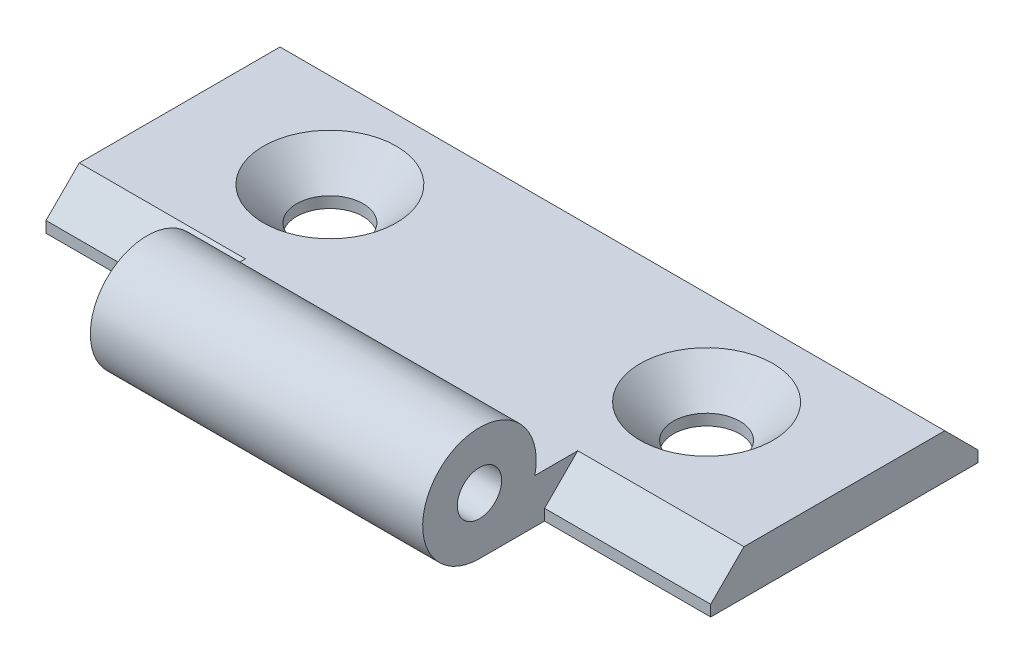
ISO-10303-21;
HEADER;
FILE_DESCRIPTION(('STEP AP214'),'2;1');
FILE_NAME('part.step','',(''),(''),'','','');
FILE_SCHEMA(('AUTOMOTIVE_DESIGN { 1 0 10303 214 1 1 1 1 }'));
ENDSEC;
DATA;
#1=APPLICATION_CONTEXT('core data for automotive mechanical design processes');
#2=APPLICATION_PROTOCOL_DEFINITION('international standard','automotive_design',2000,#1);
#3=PRODUCT_CONTEXT('',#1,'mechanical');
#4=PRODUCT('Part','Part','',(#3));
#5=PRODUCT_RELATED_PRODUCT_CATEGORY('part','',(#4));
#6=PRODUCT_DEFINITION_FORMATION('','',#4);
#7=PRODUCT_DEFINITION_CONTEXT('part definition',#1,'design');
#8=PRODUCT_DEFINITION('design','',#6,#7);
#9=PRODUCT_DEFINITION_SHAPE('','',#8);
#10=(LENGTH_UNIT() NAMED_UNIT(*) SI_UNIT(.MILLI.,.METRE.));
#11=(NAMED_UNIT(*) PLANE_ANGLE_UNIT() SI_UNIT($,.RADIAN.));
#12=(NAMED_UNIT(*) SI_UNIT($,.STERADIAN.) SOLID_ANGLE_UNIT());
#13=UNCERTAINTY_MEASURE_WITH_UNIT(LENGTH_MEASURE(1.E-05),#10,'distance_accuracy_value','');
#14=(GEOMETRIC_REPRESENTATION_CONTEXT(3) GLOBAL_UNCERTAINTY_ASSIGNED_CONTEXT((#13)) GLOBAL_UNIT_ASSIGNED_CONTEXT((#10,
#11,#12)) REPRESENTATION_CONTEXT('',''));
#15=CARTESIAN_POINT('',(0.,0.,0.));
#16=DIRECTION('',(0.,0.,1.));
#17=DIRECTION('',(1.,0.,0.));
#18=AXIS2_PLACEMENT_3D('',#15,#16,#17);
#19=CARTESIAN_POINT('',(30.,5.125,0.));
#20=DIRECTION('',(1.,0.,0.));
#21=DIRECTION('',(0.,0.,-1.));
#22=AXIS2_PLACEMENT_3D('',#19,#20,#21);
#23=PLANE('',#22);
#24=DIRECTION('',(0.,0.,1.));
#25=VECTOR('',#24,1.);
#26=CARTESIAN_POINT('',(30.,4.,-5.));
#27=LINE('',#26,#25);
#28=CARTESIAN_POINT('',(30.,4.,-27.));
#29=VERTEX_POINT('',#28);
#30=CARTESIAN_POINT('',(30.,4.,-8.87500000000002));
#31=VERTEX_POINT('',#30);
#32=EDGE_CURVE('E152',#29,#31,#27,.T.);
#33=ORIENTED_EDGE('',*,*,#32,.T.);
#34=DIRECTION('',(0.,-0.707106781186546,0.707106781186549));
#35=VECTOR('',#34,1.);
#36=CARTESIAN_POINT('',(30.,0.124999999999986,-4.99999999999999));
#37=LINE('',#36,#35);
#38=CARTESIAN_POINT('',(30.,0.999999999999997,-5.875));
#39=VERTEX_POINT('',#38);
#40=EDGE_CURVE('E127',#31,#39,#37,.T.);
#41=ORIENTED_EDGE('',*,*,#40,.T.);
#42=DIRECTION('',(0.,-1.,0.));
#43=VECTOR('',#42,1.);
#44=CARTESIAN_POINT('',(30.,10.25,-5.875));
#45=LINE('',#44,#43);
#46=CARTESIAN_POINT('',(30.,0.,-5.875));
#47=VERTEX_POINT('',#46);
#48=EDGE_CURVE('E119',#39,#47,#45,.T.);
#49=ORIENTED_EDGE('',*,*,#48,.T.);
#50=DIRECTION('',(0.,0.,-1.));
#51=VECTOR('',#50,1.);
#52=CARTESIAN_POINT('',(30.,0.,0.));
#53=LINE('',#52,#51);
#54=CARTESIAN_POINT('',(30.,0.,-30.));
#55=VERTEX_POINT('',#54);
#56=EDGE_CURVE('E124',#47,#55,#53,.T.);
#57=ORIENTED_EDGE('',*,*,#56,.T.);
#58=DIRECTION('',(0.,1.,0.));
#59=VECTOR('',#58,1.);
#60=CARTESIAN_POINT('',(30.,0.,-30.));
#61=LINE('',#60,#59);
#62=CARTESIAN_POINT('',(30.,0.999999999999984,-30.));
#63=VERTEX_POINT('',#62);
#64=EDGE_CURVE('E149',#55,#63,#61,.T.);
#65=ORIENTED_EDGE('',*,*,#64,.T.);
#66=DIRECTION('',(0.,-0.707106781186549,-0.707106781186546));
#67=VECTOR('',#66,1.);
#68=CARTESIAN_POINT('',(30.,18.0625,-12.9375000000001));
#69=LINE('',#68,#67);
#70=EDGE_CURVE('E198',#63,#29,#69,.F.);
#71=ORIENTED_EDGE('',*,*,#70,.T.);
#72=EDGE_LOOP('',(#33,#41,#49,#57,#65,#71));
#73=FACE_BOUND('',#72,.T.);
#74=ADVANCED_FACE('F37',(#73),#23,.T.);
#75=CARTESIAN_POINT('',(-30.,5.125,0.));
#76=DIRECTION('',(1.,0.,0.));
#77=DIRECTION('',(0.,0.,-1.));
#78=AXIS2_PLACEMENT_3D('',#75,#76,#77);
#79=PLANE('',#78);
#80=DIRECTION('',(0.,-1.,0.));
#81=VECTOR('',#80,1.);
#82=CARTESIAN_POINT('',(-30.,10.25,-5.875));
#83=LINE('',#82,#81);
#84=CARTESIAN_POINT('',(-30.,0.999999999999997,-5.875));
#85=VERTEX_POINT('',#84);
#86=CARTESIAN_POINT('',(-30.,0.,-5.875));
#87=VERTEX_POINT('',#86);
#88=EDGE_CURVE('E233',#85,#87,#83,.T.);
#89=ORIENTED_EDGE('',*,*,#88,.F.);
#90=DIRECTION('',(0.,0.707106781186546,-0.707106781186549));
#91=VECTOR('',#90,1.);
#92=CARTESIAN_POINT('',(-30.,0.999999999999997,-5.875));
#93=LINE('',#92,#91);
#94=CARTESIAN_POINT('',(-30.,4.,-8.87500000000002));
#95=VERTEX_POINT('',#94);
#96=EDGE_CURVE('E205',#85,#95,#93,.T.);
#97=ORIENTED_EDGE('',*,*,#96,.T.);
#98=DIRECTION('',(0.,0.,1.));
#99=VECTOR('',#98,1.);
#100=CARTESIAN_POINT('',(-30.,4.,-5.));
#101=LINE('',#100,#99);
#102=CARTESIAN_POINT('',(-30.,4.,-27.));
#103=VERTEX_POINT('',#102);
#104=EDGE_CURVE('E150',#103,#95,#101,.T.);
#105=ORIENTED_EDGE('',*,*,#104,.F.);
#106=DIRECTION('',(0.,0.707106781186549,0.707106781186546));
#107=VECTOR('',#106,1.);
#108=CARTESIAN_POINT('',(-30.,4.,-27.));
#109=LINE('',#108,#107);
#110=CARTESIAN_POINT('',(-30.,0.999999999999984,-30.));
#111=VERTEX_POINT('',#110);
#112=EDGE_CURVE('E53',#103,#111,#109,.F.);
#113=ORIENTED_EDGE('',*,*,#112,.T.);
#114=DIRECTION('',(0.,1.,0.));
#115=VECTOR('',#114,1.);
#116=CARTESIAN_POINT('',(-30.,0.,-30.));
#117=LINE('',#116,#115);
#118=CARTESIAN_POINT('',(-30.,0.,-30.));
#119=VERTEX_POINT('',#118);
#120=EDGE_CURVE('E155',#119,#111,#117,.T.);
#121=ORIENTED_EDGE('',*,*,#120,.F.);
#122=DIRECTION('',(0.,0.,-1.));
#123=VECTOR('',#122,1.);
#124=CARTESIAN_POINT('',(-30.,0.,0.));
#125=LINE('',#124,#123);
#126=EDGE_CURVE('E163',#87,#119,#125,.T.);
#127=ORIENTED_EDGE('',*,*,#126,.F.);
#128=EDGE_LOOP('',(#89,#97,#105,#113,#121,#127));
#129=FACE_BOUND('',#128,.T.);
#130=ADVANCED_FACE('F231',(#129),#79,.F.);
#131=CARTESIAN_POINT('',(30.,5.125,0.));
#132=DIRECTION('',(-1.,0.,0.));
#133=DIRECTION('',(0.,0.,1.));
#134=AXIS2_PLACEMENT_3D('',#131,#132,#133);
#135=CYLINDRICAL_SURFACE('',#134,5.125);
#136=DIRECTION('',(-1.,0.,0.));
#137=VECTOR('',#136,1.);
#138=CARTESIAN_POINT('',(30.,4.,-5.));
#139=LINE('',#138,#137);
#140=CARTESIAN_POINT('',(15.,4.,-5.));
#141=VERTEX_POINT('',#140);
#142=CARTESIAN_POINT('',(-15.,4.,-5.));
#143=VERTEX_POINT('',#142);
#144=EDGE_CURVE('E162',#141,#143,#139,.T.);
#145=ORIENTED_EDGE('',*,*,#144,.T.);
#146=CARTESIAN_POINT('',(-15.,5.125,0.));
#147=DIRECTION('',(-1.,0.,0.));
#148=DIRECTION('',(0.,0.,1.));
#149=AXIS2_PLACEMENT_3D('',#146,#147,#148);
#150=CIRCLE('',#149,5.125);
#151=CARTESIAN_POINT('',(-15.,0.,0.));
#152=VERTEX_POINT('',#151);
#153=EDGE_CURVE('E158',#152,#143,#150,.T.);
#154=ORIENTED_EDGE('',*,*,#153,.F.);
#155=DIRECTION('',(-1.,0.,0.));
#156=VECTOR('',#155,1.);
#157=CARTESIAN_POINT('',(30.,0.,0.));
#158=LINE('',#157,#156);
#159=CARTESIAN_POINT('',(15.,0.,0.));
#160=VERTEX_POINT('',#159);
#161=EDGE_CURVE('E169',#160,#152,#158,.T.);
#162=ORIENTED_EDGE('',*,*,#161,.F.);
#163=CARTESIAN_POINT('',(15.,5.125,0.));
#164=DIRECTION('',(1.,0.,0.));
#165=DIRECTION('',(0.,0.,-1.));
#166=AXIS2_PLACEMENT_3D('',#163,#164,#165);
#167=CIRCLE('',#166,5.125);
#168=EDGE_CURVE('E182',#141,#160,#167,.T.);
#169=ORIENTED_EDGE('',*,*,#168,.F.);
#170=EDGE_LOOP('',(#145,#154,#162,#169));
#171=FACE_BOUND('',#170,.T.);
#172=ADVANCED_FACE('F258',(#171),#135,.T.);
#173=CARTESIAN_POINT('',(30.,0.,0.));
#174=DIRECTION('',(0.,1.,0.));
#175=DIRECTION('',(0.,0.,1.));
#176=AXIS2_PLACEMENT_3D('',#173,#174,#175);
#177=PLANE('',#176);
#178=CARTESIAN_POINT('',(17.,0.,-18.5));
#179=DIRECTION('',(0.,1.,0.));
#180=DIRECTION('',(0.,0.,1.));
#181=AXIS2_PLACEMENT_3D('',#178,#179,#180);
#182=CIRCLE('',#181,3.);
#183=CARTESIAN_POINT('',(17.,0.,-15.5));
#184=VERTEX_POINT('',#183);
#185=EDGE_CURVE('E243',#184,#184,#182,.T.);
#186=ORIENTED_EDGE('',*,*,#185,.T.);
#187=EDGE_LOOP('',(#186));
#188=FACE_BOUND('',#187,.T.);
#189=DIRECTION('',(0.,0.,-1.));
#190=VECTOR('',#189,1.);
#191=CARTESIAN_POINT('',(-15.,0.,5.125));
#192=LINE('',#191,#190);
#193=CARTESIAN_POINT('',(-15.,0.,-5.875));
#194=VERTEX_POINT('',#193);
#195=EDGE_CURVE('E131',#152,#194,#192,.T.);
#196=ORIENTED_EDGE('',*,*,#195,.T.);
#197=DIRECTION('',(-1.,0.,0.));
#198=VECTOR('',#197,1.);
#199=CARTESIAN_POINT('',(-30.,0.,-5.875));
#200=LINE('',#199,#198);
#201=EDGE_CURVE('E242',#194,#87,#200,.T.);
#202=ORIENTED_EDGE('',*,*,#201,.T.);
#203=ORIENTED_EDGE('',*,*,#126,.T.);
#204=DIRECTION('',(-1.,0.,0.));
#205=VECTOR('',#204,1.);
#206=CARTESIAN_POINT('',(30.,0.,-30.));
#207=LINE('',#206,#205);
#208=EDGE_CURVE('E147',#55,#119,#207,.T.);
#209=ORIENTED_EDGE('',*,*,#208,.F.);
#210=ORIENTED_EDGE('',*,*,#56,.F.);
#211=DIRECTION('',(-1.,0.,0.));
#212=VECTOR('',#211,1.);
#213=CARTESIAN_POINT('',(30.,0.,-5.875));
#214=LINE('',#213,#212);
#215=CARTESIAN_POINT('',(15.,0.,-5.875));
#216=VERTEX_POINT('',#215);
#217=EDGE_CURVE('E135',#47,#216,#214,.T.);
#218=ORIENTED_EDGE('',*,*,#217,.T.);
#219=DIRECTION('',(0.,0.,1.));
#220=VECTOR('',#219,1.);
#221=CARTESIAN_POINT('',(15.,0.,5.125));
#222=LINE('',#221,#220);
#223=EDGE_CURVE('E141',#216,#160,#222,.T.);
#224=ORIENTED_EDGE('',*,*,#223,.T.);
#225=ORIENTED_EDGE('',*,*,#161,.T.);
#226=EDGE_LOOP('',(#196,#202,#203,#209,#210,#218,#224,#225));
#227=FACE_BOUND('',#226,.T.);
#228=CARTESIAN_POINT('',(-17.,0.,-18.5));
#229=DIRECTION('',(0.,1.,0.));
#230=DIRECTION('',(0.,0.,1.));
#231=AXIS2_PLACEMENT_3D('',#228,#229,#230);
#232=CIRCLE('',#231,3.);
#233=CARTESIAN_POINT('',(-17.,0.,-15.5));
#234=VERTEX_POINT('',#233);
#235=EDGE_CURVE('E177',#234,#234,#232,.T.);
#236=ORIENTED_EDGE('',*,*,#235,.T.);
#237=EDGE_LOOP('',(#236));
#238=FACE_BOUND('',#237,.T.);
#239=ADVANCED_FACE('F144',(#188,#227,#238),#177,.F.);
#240=CARTESIAN_POINT('',(30.,0.,-30.));
#241=DIRECTION('',(0.,0.,1.));
#242=DIRECTION('',(1.,0.,0.));
#243=AXIS2_PLACEMENT_3D('',#240,#241,#242);
#244=PLANE('',#243);
#245=ORIENTED_EDGE('',*,*,#120,.T.);
#246=DIRECTION('',(1.,0.,0.));
#247=VECTOR('',#246,1.);
#248=CARTESIAN_POINT('',(30.,0.999999999999984,-30.));
#249=LINE('',#248,#247);
#250=EDGE_CURVE('E213',#111,#63,#249,.T.);
#251=ORIENTED_EDGE('',*,*,#250,.T.);
#252=ORIENTED_EDGE('',*,*,#64,.F.);
#253=ORIENTED_EDGE('',*,*,#208,.T.);
#254=EDGE_LOOP('',(#245,#251,#252,#253));
#255=FACE_BOUND('',#254,.T.);
#256=ADVANCED_FACE('F263',(#255),#244,.F.);
#257=CARTESIAN_POINT('',(30.,4.,-5.));
#258=DIRECTION('',(0.,-1.,0.));
#259=DIRECTION('',(0.,0.,-1.));
#260=AXIS2_PLACEMENT_3D('',#257,#258,#259);
#261=PLANE('',#260);
#262=CARTESIAN_POINT('',(-17.,4.,-18.5));
#263=DIRECTION('',(0.,-1.,0.));
#264=DIRECTION('',(0.,0.,-1.));
#265=AXIS2_PLACEMENT_3D('',#262,#263,#264);
#266=CIRCLE('',#265,6.00000000000001);
#267=CARTESIAN_POINT('',(-17.,4.,-24.5));
#268=VERTEX_POINT('',#267);
#269=EDGE_CURVE('E190',#268,#268,#266,.T.);
#270=ORIENTED_EDGE('',*,*,#269,.T.);
#271=EDGE_LOOP('',(#270));
#272=FACE_BOUND('',#271,.T.);
#273=CARTESIAN_POINT('',(17.,4.,-18.5));
#274=DIRECTION('',(0.,-1.,0.));
#275=DIRECTION('',(0.,0.,-1.));
#276=AXIS2_PLACEMENT_3D('',#273,#274,#275);
#277=CIRCLE('',#276,6.00000000000001);
#278=CARTESIAN_POINT('',(17.,4.,-24.5));
#279=VERTEX_POINT('',#278);
#280=EDGE_CURVE('E187',#279,#279,#277,.T.);
#281=ORIENTED_EDGE('',*,*,#280,.T.);
#282=EDGE_LOOP('',(#281));
#283=FACE_BOUND('',#282,.T.);
#284=DIRECTION('',(0.,0.,1.));
#285=VECTOR('',#284,1.);
#286=CARTESIAN_POINT('',(15.,4.,-5.));
#287=LINE('',#286,#285);
#288=CARTESIAN_POINT('',(15.,4.,-8.87500000000002));
#289=VERTEX_POINT('',#288);
#290=EDGE_CURVE('E176',#289,#141,#287,.T.);
#291=ORIENTED_EDGE('',*,*,#290,.F.);
#292=DIRECTION('',(1.,0.,0.));
#293=VECTOR('',#292,1.);
#294=CARTESIAN_POINT('',(30.,4.,-8.87500000000002));
#295=LINE('',#294,#293);
#296=EDGE_CURVE('E196',#289,#31,#295,.T.);
#297=ORIENTED_EDGE('',*,*,#296,.T.);
#298=ORIENTED_EDGE('',*,*,#32,.F.);
#299=DIRECTION('',(-1.,0.,0.));
#300=VECTOR('',#299,1.);
#301=CARTESIAN_POINT('',(30.,4.,-27.));
#302=LINE('',#301,#300);
#303=EDGE_CURVE('E184',#29,#103,#302,.T.);
#304=ORIENTED_EDGE('',*,*,#303,.T.);
#305=ORIENTED_EDGE('',*,*,#104,.T.);
#306=DIRECTION('',(1.,0.,0.));
#307=VECTOR('',#306,1.);
#308=CARTESIAN_POINT('',(-15.,4.,-8.87500000000002));
#309=LINE('',#308,#307);
#310=CARTESIAN_POINT('',(-15.,4.,-8.87500000000002));
#311=VERTEX_POINT('',#310);
#312=EDGE_CURVE('E193',#95,#311,#309,.T.);
#313=ORIENTED_EDGE('',*,*,#312,.T.);
#314=DIRECTION('',(0.,0.,-1.));
#315=VECTOR('',#314,1.);
#316=CARTESIAN_POINT('',(-15.,4.,-5.));
#317=LINE('',#316,#315);
#318=EDGE_CURVE('E181',#143,#311,#317,.T.);
#319=ORIENTED_EDGE('',*,*,#318,.F.);
#320=ORIENTED_EDGE('',*,*,#144,.F.);
#321=EDGE_LOOP('',(#291,#297,#298,#304,#305,#313,#319,#320));
#322=FACE_BOUND('',#321,.T.);
#323=ADVANCED_FACE('F224',(#272,#283,#322),#261,.F.);
#324=CARTESIAN_POINT('',(30.,10.25,-5.875));
#325=DIRECTION('',(0.,0.,1.));
#326=DIRECTION('',(1.,0.,0.));
#327=AXIS2_PLACEMENT_3D('',#324,#325,#326);
#328=PLANE('',#327);
#329=ORIENTED_EDGE('',*,*,#48,.F.);
#330=DIRECTION('',(-1.,0.,0.));
#331=VECTOR('',#330,1.);
#332=CARTESIAN_POINT('',(15.,0.999999999999997,-5.875));
#333=LINE('',#332,#331);
#334=CARTESIAN_POINT('',(15.,0.999999999999997,-5.875));
#335=VERTEX_POINT('',#334);
#336=EDGE_CURVE('E172',#39,#335,#333,.T.);
#337=ORIENTED_EDGE('',*,*,#336,.T.);
#338=DIRECTION('',(0.,-1.,0.));
#339=VECTOR('',#338,1.);
#340=CARTESIAN_POINT('',(15.,10.25,-5.875));
#341=LINE('',#340,#339);
#342=EDGE_CURVE('E132',#335,#216,#341,.T.);
#343=ORIENTED_EDGE('',*,*,#342,.T.);
#344=ORIENTED_EDGE('',*,*,#217,.F.);
#345=EDGE_LOOP('',(#329,#337,#343,#344));
#346=FACE_BOUND('',#345,.T.);
#347=ADVANCED_FACE('F136',(#346),#328,.T.);
#348=CARTESIAN_POINT('',(15.,10.25,5.125));
#349=DIRECTION('',(1.,0.,0.));
#350=DIRECTION('',(0.,0.,-1.));
#351=AXIS2_PLACEMENT_3D('',#348,#349,#350);
#352=PLANE('',#351);
#353=CARTESIAN_POINT('',(15.,5.125,0.));
#354=DIRECTION('',(1.,0.,0.));
#355=DIRECTION('',(0.,0.,-1.));
#356=AXIS2_PLACEMENT_3D('',#353,#354,#355);
#357=CIRCLE('',#356,2.);
#358=CARTESIAN_POINT('',(15.,5.125,-2.));
#359=VERTEX_POINT('',#358);
#360=EDGE_CURVE('E173',#359,#359,#357,.T.);
#361=ORIENTED_EDGE('',*,*,#360,.F.);
#362=EDGE_LOOP('',(#361));
#363=FACE_BOUND('',#362,.T.);
#364=ORIENTED_EDGE('',*,*,#168,.T.);
#365=ORIENTED_EDGE('',*,*,#223,.F.);
#366=ORIENTED_EDGE('',*,*,#342,.F.);
#367=DIRECTION('',(0.,0.707106781186546,-0.707106781186549));
#368=VECTOR('',#367,1.);
#369=CARTESIAN_POINT('',(15.,0.999999999999997,-5.875));
#370=LINE('',#369,#368);
#371=EDGE_CURVE('E46',#335,#289,#370,.T.);
#372=ORIENTED_EDGE('',*,*,#371,.T.);
#373=ORIENTED_EDGE('',*,*,#290,.T.);
#374=EDGE_LOOP('',(#364,#365,#366,#372,#373));
#375=FACE_BOUND('',#374,.T.);
#376=ADVANCED_FACE('F218',(#363,#375),#352,.T.);
#377=CARTESIAN_POINT('',(-30.,10.25,-5.875));
#378=DIRECTION('',(0.,0.,1.));
#379=DIRECTION('',(1.,0.,0.));
#380=AXIS2_PLACEMENT_3D('',#377,#378,#379);
#381=PLANE('',#380);
#382=DIRECTION('',(0.,-1.,0.));
#383=VECTOR('',#382,1.);
#384=CARTESIAN_POINT('',(-15.,10.25,-5.875));
#385=LINE('',#384,#383);
#386=CARTESIAN_POINT('',(-15.,0.999999999999997,-5.875));
#387=VERTEX_POINT('',#386);
#388=EDGE_CURVE('E241',#387,#194,#385,.T.);
#389=ORIENTED_EDGE('',*,*,#388,.F.);
#390=DIRECTION('',(-1.,0.,0.));
#391=VECTOR('',#390,1.);
#392=CARTESIAN_POINT('',(-30.,0.999999999999997,-5.875));
#393=LINE('',#392,#391);
#394=EDGE_CURVE('E201',#387,#85,#393,.T.);
#395=ORIENTED_EDGE('',*,*,#394,.T.);
#396=ORIENTED_EDGE('',*,*,#88,.T.);
#397=ORIENTED_EDGE('',*,*,#201,.F.);
#398=EDGE_LOOP('',(#389,#395,#396,#397));
#399=FACE_BOUND('',#398,.T.);
#400=ADVANCED_FACE('F238',(#399),#381,.T.);
#401=CARTESIAN_POINT('',(-15.,10.25,5.125));
#402=DIRECTION('',(-1.,0.,0.));
#403=DIRECTION('',(0.,0.,1.));
#404=AXIS2_PLACEMENT_3D('',#401,#402,#403);
#405=PLANE('',#404);
#406=CARTESIAN_POINT('',(-15.,5.125,0.));
#407=DIRECTION('',(-1.,0.,0.));
#408=DIRECTION('',(0.,0.,1.));
#409=AXIS2_PLACEMENT_3D('',#406,#407,#408);
#410=CIRCLE('',#409,2.);
#411=CARTESIAN_POINT('',(-15.,5.125,2.));
#412=VERTEX_POINT('',#411);
#413=EDGE_CURVE('E178',#412,#412,#410,.T.);
#414=ORIENTED_EDGE('',*,*,#413,.F.);
#415=EDGE_LOOP('',(#414));
#416=FACE_BOUND('',#415,.T.);
#417=ORIENTED_EDGE('',*,*,#153,.T.);
#418=ORIENTED_EDGE('',*,*,#318,.T.);
#419=DIRECTION('',(0.,-0.707106781186546,0.707106781186549));
#420=VECTOR('',#419,1.);
#421=CARTESIAN_POINT('',(-15.,0.999999999999997,-5.875));
#422=LINE('',#421,#420);
#423=EDGE_CURVE('E11',#311,#387,#422,.T.);
#424=ORIENTED_EDGE('',*,*,#423,.T.);
#425=ORIENTED_EDGE('',*,*,#388,.T.);
#426=ORIENTED_EDGE('',*,*,#195,.F.);
#427=EDGE_LOOP('',(#417,#418,#424,#425,#426));
#428=FACE_BOUND('',#427,.T.);
#429=ADVANCED_FACE('F255',(#416,#428),#405,.T.);
#430=CARTESIAN_POINT('',(-17.,10.25,-18.5));
#431=DIRECTION('',(0.,-1.,0.));
#432=DIRECTION('',(0.,0.,-1.));
#433=AXIS2_PLACEMENT_3D('',#430,#431,#432);
#434=CYLINDRICAL_SURFACE('',#433,3.);
#435=CARTESIAN_POINT('',(-17.,1.,-18.5));
#436=DIRECTION('',(0.,-1.,0.));
#437=DIRECTION('',(0.,0.,-1.));
#438=AXIS2_PLACEMENT_3D('',#435,#436,#437);
#439=CIRCLE('',#438,3.);
#440=CARTESIAN_POINT('',(-17.,1.,-21.5));
#441=VERTEX_POINT('',#440);
#442=EDGE_CURVE('E207',#441,#441,#439,.F.);
#443=ORIENTED_EDGE('',*,*,#442,.T.);
#444=EDGE_LOOP('',(#443));
#445=FACE_BOUND('',#444,.T.);
#446=ORIENTED_EDGE('',*,*,#235,.F.);
#447=EDGE_LOOP('',(#446));
#448=FACE_BOUND('',#447,.T.);
#449=ADVANCED_FACE('F286',(#445,#448),#434,.F.);
#450=CARTESIAN_POINT('',(17.,10.25,-18.5));
#451=DIRECTION('',(0.,-1.,0.));
#452=DIRECTION('',(0.,0.,-1.));
#453=AXIS2_PLACEMENT_3D('',#450,#451,#452);
#454=CYLINDRICAL_SURFACE('',#453,3.);
#455=CARTESIAN_POINT('',(17.,1.00000000000001,-18.5));
#456=DIRECTION('',(0.,-1.,0.));
#457=DIRECTION('',(0.,0.,-1.));
#458=AXIS2_PLACEMENT_3D('',#455,#456,#457);
#459=CIRCLE('',#458,3.);
#460=CARTESIAN_POINT('',(17.,1.00000000000001,-21.5));
#461=VERTEX_POINT('',#460);
#462=EDGE_CURVE('E210',#461,#461,#459,.F.);
#463=ORIENTED_EDGE('',*,*,#462,.T.);
#464=EDGE_LOOP('',(#463));
#465=FACE_BOUND('',#464,.T.);
#466=ORIENTED_EDGE('',*,*,#185,.F.);
#467=EDGE_LOOP('',(#466));
#468=FACE_BOUND('',#467,.T.);
#469=ADVANCED_FACE('F284',(#465,#468),#454,.F.);
#470=CARTESIAN_POINT('',(30.,5.125,0.));
#471=DIRECTION('',(-1.,0.,0.));
#472=DIRECTION('',(0.,0.,1.));
#473=AXIS2_PLACEMENT_3D('',#470,#471,#472);
#474=CYLINDRICAL_SURFACE('',#473,2.);
#475=ORIENTED_EDGE('',*,*,#360,.T.);
#476=EDGE_LOOP('',(#475));
#477=FACE_BOUND('',#476,.T.);
#478=ORIENTED_EDGE('',*,*,#413,.T.);
#479=EDGE_LOOP('',(#478));
#480=FACE_BOUND('',#479,.T.);
#481=ADVANCED_FACE('F281',(#477,#480),#474,.F.);
#482=CARTESIAN_POINT('',(30.,0.999999999999997,-5.875));
#483=DIRECTION('',(0.,0.707106781186549,0.707106781186546));
#484=DIRECTION('',(1.,0.,0.));
#485=AXIS2_PLACEMENT_3D('',#482,#483,#484);
#486=PLANE('',#485);
#487=ORIENTED_EDGE('',*,*,#40,.F.);
#488=ORIENTED_EDGE('',*,*,#296,.F.);
#489=ORIENTED_EDGE('',*,*,#371,.F.);
#490=ORIENTED_EDGE('',*,*,#336,.F.);
#491=EDGE_LOOP('',(#487,#488,#489,#490));
#492=FACE_BOUND('',#491,.T.);
#493=ADVANCED_FACE('F221',(#492),#486,.T.);
#494=CARTESIAN_POINT('',(-30.,0.999999999999997,-5.875));
#495=DIRECTION('',(0.,0.707106781186549,0.707106781186546));
#496=DIRECTION('',(1.,0.,0.));
#497=AXIS2_PLACEMENT_3D('',#494,#495,#496);
#498=PLANE('',#497);
#499=ORIENTED_EDGE('',*,*,#423,.F.);
#500=ORIENTED_EDGE('',*,*,#312,.F.);
#501=ORIENTED_EDGE('',*,*,#96,.F.);
#502=ORIENTED_EDGE('',*,*,#394,.F.);
#503=EDGE_LOOP('',(#499,#500,#501,#502));
#504=FACE_BOUND('',#503,.T.);
#505=ADVANCED_FACE('F236',(#504),#498,.T.);
#506=CARTESIAN_POINT('',(-17.,1.,-18.5));
#507=DIRECTION('',(0.,1.,0.));
#508=DIRECTION('',(0.,0.,1.));
#509=AXIS2_PLACEMENT_3D('',#506,#507,#508);
#510=CONICAL_SURFACE('',#509,3.,0.785398163397451);
#511=ORIENTED_EDGE('',*,*,#269,.F.);
#512=EDGE_LOOP('',(#511));
#513=FACE_BOUND('',#512,.T.);
#514=ORIENTED_EDGE('',*,*,#442,.F.);
#515=EDGE_LOOP('',(#514));
#516=FACE_BOUND('',#515,.T.);
#517=ADVANCED_FACE('F342',(#513,#516),#510,.F.);
#518=CARTESIAN_POINT('',(17.,1.00000000000001,-18.5));
#519=DIRECTION('',(0.,1.,0.));
#520=DIRECTION('',(0.,0.,1.));
#521=AXIS2_PLACEMENT_3D('',#518,#519,#520);
#522=CONICAL_SURFACE('',#521,3.,0.785398163397451);
#523=ORIENTED_EDGE('',*,*,#280,.F.);
#524=EDGE_LOOP('',(#523));
#525=FACE_BOUND('',#524,.T.);
#526=ORIENTED_EDGE('',*,*,#462,.F.);
#527=EDGE_LOOP('',(#526));
#528=FACE_BOUND('',#527,.T.);
#529=ADVANCED_FACE('F349',(#525,#528),#522,.F.);
#530=CARTESIAN_POINT('',(30.,4.,-27.));
#531=DIRECTION('',(0.,-0.707106781186546,0.707106781186549));
#532=DIRECTION('',(-1.,0.,0.));
#533=AXIS2_PLACEMENT_3D('',#530,#531,#532);
#534=PLANE('',#533);
#535=ORIENTED_EDGE('',*,*,#70,.F.);
#536=ORIENTED_EDGE('',*,*,#250,.F.);
#537=ORIENTED_EDGE('',*,*,#112,.F.);
#538=ORIENTED_EDGE('',*,*,#303,.F.);
#539=EDGE_LOOP('',(#535,#536,#537,#538));
#540=FACE_BOUND('',#539,.T.);
#541=ADVANCED_FACE('F40',(#540),#534,.F.);
#542=CLOSED_SHELL('',(#74,#130,#172,#239,#256,#323,#347,#376,#400,#429,#449,#469,#481,#493,#505,
#517,#529,#541));
#543=MANIFOLD_SOLID_BREP('B2',#542);
#544=ADVANCED_BREP_SHAPE_REPRESENTATION('',(#18,#543),#14);
#545=SHAPE_DEFINITION_REPRESENTATION(#9,#544);
ENDSEC;
END-ISO-10303-21;
